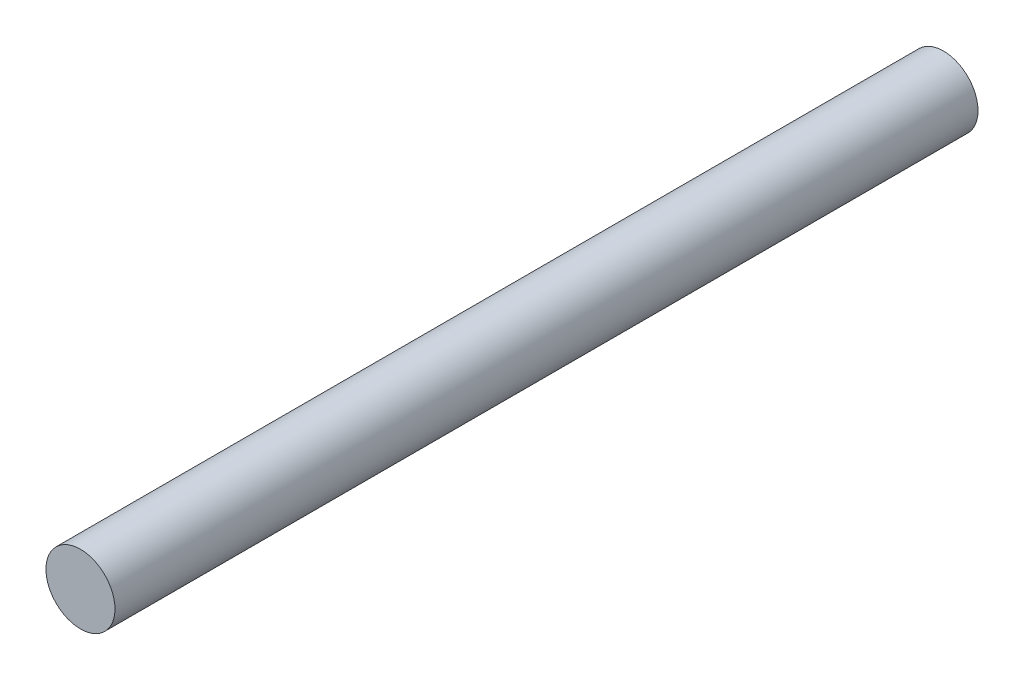
ISO-10303-21;
HEADER;
FILE_DESCRIPTION(('STEP AP214'),'2;1');
FILE_NAME('part.step','',(''),(''),'','','');
FILE_SCHEMA(('AUTOMOTIVE_DESIGN { 1 0 10303 214 1 1 1 1 }'));
ENDSEC;
DATA;
#1=APPLICATION_CONTEXT('core data for automotive mechanical design processes');
#2=APPLICATION_PROTOCOL_DEFINITION('international standard','automotive_design',2000,#1);
#3=PRODUCT_CONTEXT('',#1,'mechanical');
#4=PRODUCT('Part','Part','',(#3));
#5=PRODUCT_RELATED_PRODUCT_CATEGORY('part','',(#4));
#6=PRODUCT_DEFINITION_FORMATION('','',#4);
#7=PRODUCT_DEFINITION_CONTEXT('part definition',#1,'design');
#8=PRODUCT_DEFINITION('design','',#6,#7);
#9=PRODUCT_DEFINITION_SHAPE('','',#8);
#10=(LENGTH_UNIT() NAMED_UNIT(*) SI_UNIT(.MILLI.,.METRE.));
#11=(NAMED_UNIT(*) PLANE_ANGLE_UNIT() SI_UNIT($,.RADIAN.));
#12=(NAMED_UNIT(*) SI_UNIT($,.STERADIAN.) SOLID_ANGLE_UNIT());
#13=UNCERTAINTY_MEASURE_WITH_UNIT(LENGTH_MEASURE(1.E-05),#10,'distance_accuracy_value','');
#14=(GEOMETRIC_REPRESENTATION_CONTEXT(3) GLOBAL_UNCERTAINTY_ASSIGNED_CONTEXT((#13)) GLOBAL_UNIT_ASSIGNED_CONTEXT((#10,
#11,#12)) REPRESENTATION_CONTEXT('',''));
#15=CARTESIAN_POINT('',(0.,0.,0.));
#16=DIRECTION('',(0.,0.,1.));
#17=DIRECTION('',(1.,0.,0.));
#18=AXIS2_PLACEMENT_3D('',#15,#16,#17);
#19=CARTESIAN_POINT('',(0.,0.,20.));
#20=DIRECTION('',(0.,0.,-1.));
#21=DIRECTION('',(-1.,0.,0.));
#22=AXIS2_PLACEMENT_3D('',#19,#20,#21);
#23=CYLINDRICAL_SURFACE('',#22,0.8);
#24=CARTESIAN_POINT('',(0.,0.,20.));
#25=DIRECTION('',(0.,0.,1.));
#26=DIRECTION('',(1.,0.,0.));
#27=AXIS2_PLACEMENT_3D('',#24,#25,#26);
#28=CIRCLE('',#27,0.8);
#29=CARTESIAN_POINT('',(0.8,0.,20.));
#30=VERTEX_POINT('',#29);
#31=EDGE_CURVE('E10',#30,#30,#28,.T.);
#32=ORIENTED_EDGE('',*,*,#31,.F.);
#33=EDGE_LOOP('',(#32));
#34=FACE_BOUND('',#33,.T.);
#35=CARTESIAN_POINT('',(0.,0.,0.));
#36=DIRECTION('',(0.,0.,1.));
#37=DIRECTION('',(1.,0.,0.));
#38=AXIS2_PLACEMENT_3D('',#35,#36,#37);
#39=CIRCLE('',#38,0.8);
#40=CARTESIAN_POINT('',(0.8,0.,0.));
#41=VERTEX_POINT('',#40);
#42=EDGE_CURVE('E38',#41,#41,#39,.T.);
#43=ORIENTED_EDGE('',*,*,#42,.T.);
#44=EDGE_LOOP('',(#43));
#45=FACE_BOUND('',#44,.T.);
#46=ADVANCED_FACE('F35',(#34,#45),#23,.T.);
#47=CARTESIAN_POINT('',(0.,0.,20.));
#48=DIRECTION('',(0.,0.,1.));
#49=DIRECTION('',(1.,0.,0.));
#50=AXIS2_PLACEMENT_3D('',#47,#48,#49);
#51=PLANE('',#50);
#52=ORIENTED_EDGE('',*,*,#31,.T.);
#53=EDGE_LOOP('',(#52));
#54=FACE_BOUND('',#53,.T.);
#55=ADVANCED_FACE('F50',(#54),#51,.T.);
#56=CARTESIAN_POINT('',(0.,0.,0.));
#57=DIRECTION('',(0.,0.,1.));
#58=DIRECTION('',(1.,0.,0.));
#59=AXIS2_PLACEMENT_3D('',#56,#57,#58);
#60=PLANE('',#59);
#61=ORIENTED_EDGE('',*,*,#42,.F.);
#62=EDGE_LOOP('',(#61));
#63=FACE_BOUND('',#62,.T.);
#64=ADVANCED_FACE('F48',(#63),#60,.F.);
#65=CLOSED_SHELL('',(#46,#55,#64));
#66=MANIFOLD_SOLID_BREP('B2',#65);
#67=ADVANCED_BREP_SHAPE_REPRESENTATION('',(#18,#66),#14);
#68=SHAPE_DEFINITION_REPRESENTATION(#9,#67);
ENDSEC;
END-ISO-10303-21;
